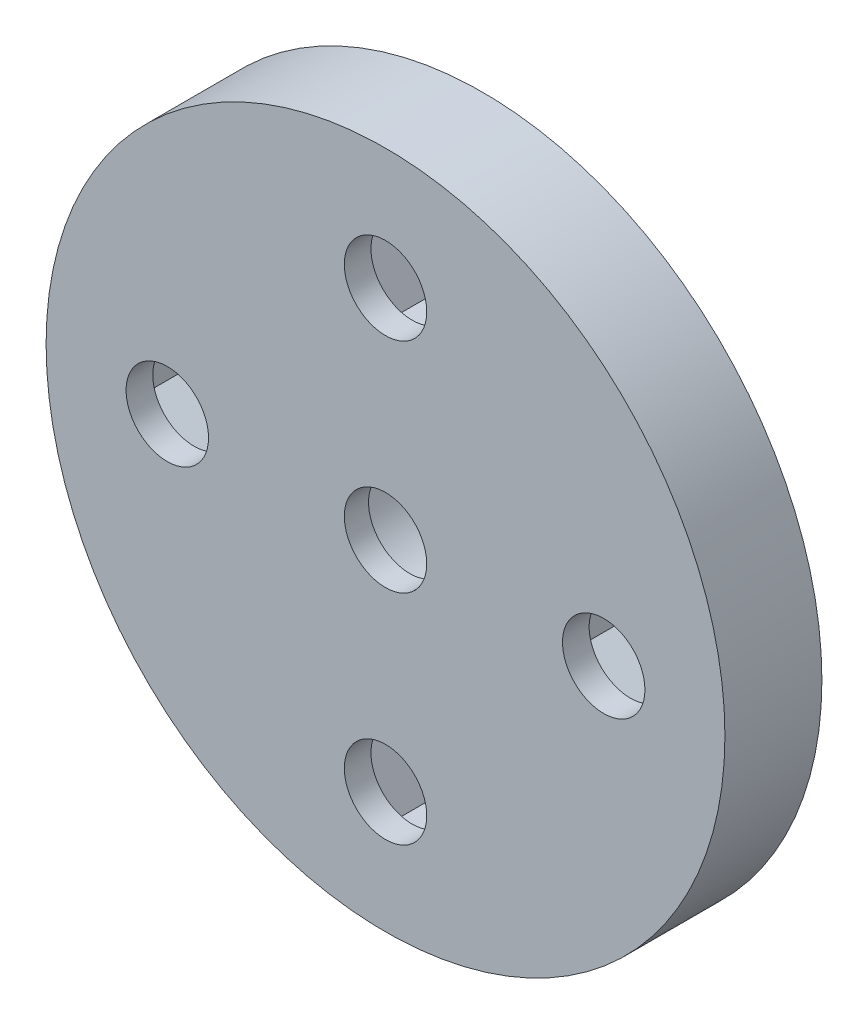
ISO-10303-21;
HEADER;
FILE_DESCRIPTION(('STEP AP214'),'2;1');
FILE_NAME('part.step','',(''),(''),'','','');
FILE_SCHEMA(('AUTOMOTIVE_DESIGN { 1 0 10303 214 1 1 1 1 }'));
ENDSEC;
DATA;
#1=APPLICATION_CONTEXT('core data for automotive mechanical design processes');
#2=APPLICATION_PROTOCOL_DEFINITION('international standard','automotive_design',2000,#1);
#3=PRODUCT_CONTEXT('',#1,'mechanical');
#4=PRODUCT('Part','Part','',(#3));
#5=PRODUCT_RELATED_PRODUCT_CATEGORY('part','',(#4));
#6=PRODUCT_DEFINITION_FORMATION('','',#4);
#7=PRODUCT_DEFINITION_CONTEXT('part definition',#1,'design');
#8=PRODUCT_DEFINITION('design','',#6,#7);
#9=PRODUCT_DEFINITION_SHAPE('','',#8);
#10=(LENGTH_UNIT() NAMED_UNIT(*) SI_UNIT(.MILLI.,.METRE.));
#11=(NAMED_UNIT(*) PLANE_ANGLE_UNIT() SI_UNIT($,.RADIAN.));
#12=(NAMED_UNIT(*) SI_UNIT($,.STERADIAN.) SOLID_ANGLE_UNIT());
#13=UNCERTAINTY_MEASURE_WITH_UNIT(LENGTH_MEASURE(1.E-05),#10,'distance_accuracy_value','');
#14=(GEOMETRIC_REPRESENTATION_CONTEXT(3) GLOBAL_UNCERTAINTY_ASSIGNED_CONTEXT((#13)) GLOBAL_UNIT_ASSIGNED_CONTEXT((#10,
#11,#12)) REPRESENTATION_CONTEXT('',''));
#15=CARTESIAN_POINT('',(0.,0.,0.));
#16=DIRECTION('',(0.,0.,1.));
#17=DIRECTION('',(1.,0.,0.));
#18=AXIS2_PLACEMENT_3D('',#15,#16,#17);
#19=CARTESIAN_POINT('',(0.,0.,0.));
#20=DIRECTION('',(0.,0.,1.));
#21=DIRECTION('',(1.,0.,0.));
#22=AXIS2_PLACEMENT_3D('',#19,#20,#21);
#23=PLANE('',#22);
#24=DIRECTION('',(-1.,0.,0.));
#25=VECTOR('',#24,1.);
#26=CARTESIAN_POINT('',(1.64544826719043,11.85,0.));
#27=LINE('',#26,#25);
#28=CARTESIAN_POINT('',(1.64544826719043,11.85,0.));
#29=VERTEX_POINT('',#28);
#30=CARTESIAN_POINT('',(-1.64544826719043,11.85,0.));
#31=VERTEX_POINT('',#30);
#32=EDGE_CURVE('E72',#29,#31,#27,.T.);
#33=ORIENTED_EDGE('',*,*,#32,.T.);
#34=DIRECTION('',(-0.5,-0.866025403784439,0.));
#35=VECTOR('',#34,1.);
#36=CARTESIAN_POINT('',(-1.64544826719043,11.85,0.));
#37=LINE('',#36,#35);
#38=CARTESIAN_POINT('',(-3.29089653438087,9.,0.));
#39=VERTEX_POINT('',#38);
#40=EDGE_CURVE('E281',#31,#39,#37,.T.);
#41=ORIENTED_EDGE('',*,*,#40,.T.);
#42=DIRECTION('',(0.5,-0.866025403784439,0.));
#43=VECTOR('',#42,1.);
#44=CARTESIAN_POINT('',(-3.29089653438087,9.,0.));
#45=LINE('',#44,#43);
#46=CARTESIAN_POINT('',(-1.64544826719044,6.15,0.));
#47=VERTEX_POINT('',#46);
#48=EDGE_CURVE('E278',#39,#47,#45,.T.);
#49=ORIENTED_EDGE('',*,*,#48,.T.);
#50=DIRECTION('',(1.,0.,0.));
#51=VECTOR('',#50,1.);
#52=CARTESIAN_POINT('',(-1.64544826719044,6.15,0.));
#53=LINE('',#52,#51);
#54=CARTESIAN_POINT('',(1.64544826719043,6.15,0.));
#55=VERTEX_POINT('',#54);
#56=EDGE_CURVE('E277',#47,#55,#53,.T.);
#57=ORIENTED_EDGE('',*,*,#56,.T.);
#58=DIRECTION('',(0.5,0.866025403784439,0.));
#59=VECTOR('',#58,1.);
#60=CARTESIAN_POINT('',(1.64544826719043,6.15,0.));
#61=LINE('',#60,#59);
#62=CARTESIAN_POINT('',(3.29089653438087,9.,0.));
#63=VERTEX_POINT('',#62);
#64=EDGE_CURVE('E271',#55,#63,#61,.T.);
#65=ORIENTED_EDGE('',*,*,#64,.T.);
#66=DIRECTION('',(-0.5,0.866025403784439,0.));
#67=VECTOR('',#66,1.);
#68=CARTESIAN_POINT('',(3.29089653438087,9.,0.));
#69=LINE('',#68,#67);
#70=EDGE_CURVE('E270',#63,#29,#69,.T.);
#71=ORIENTED_EDGE('',*,*,#70,.T.);
#72=EDGE_LOOP('',(#33,#41,#49,#57,#65,#71));
#73=FACE_BOUND('',#72,.T.);
#74=DIRECTION('',(1.,0.,0.));
#75=VECTOR('',#74,1.);
#76=CARTESIAN_POINT('',(-1.64544826719044,-11.85,0.));
#77=LINE('',#76,#75);
#78=CARTESIAN_POINT('',(-1.64544826719044,-11.85,0.));
#79=VERTEX_POINT('',#78);
#80=CARTESIAN_POINT('',(1.64544826719043,-11.85,0.));
#81=VERTEX_POINT('',#80);
#82=EDGE_CURVE('E315',#79,#81,#77,.T.);
#83=ORIENTED_EDGE('',*,*,#82,.T.);
#84=DIRECTION('',(0.5,0.866025403784439,0.));
#85=VECTOR('',#84,1.);
#86=CARTESIAN_POINT('',(1.64544826719043,-11.85,0.));
#87=LINE('',#86,#85);
#88=CARTESIAN_POINT('',(3.29089653438087,-9.,0.));
#89=VERTEX_POINT('',#88);
#90=EDGE_CURVE('E410',#81,#89,#87,.T.);
#91=ORIENTED_EDGE('',*,*,#90,.T.);
#92=DIRECTION('',(-0.5,0.866025403784439,0.));
#93=VECTOR('',#92,1.);
#94=CARTESIAN_POINT('',(3.29089653438087,-9.,0.));
#95=LINE('',#94,#93);
#96=CARTESIAN_POINT('',(1.64544826719043,-6.15,0.));
#97=VERTEX_POINT('',#96);
#98=EDGE_CURVE('E404',#89,#97,#95,.T.);
#99=ORIENTED_EDGE('',*,*,#98,.T.);
#100=DIRECTION('',(-1.,0.,0.));
#101=VECTOR('',#100,1.);
#102=CARTESIAN_POINT('',(1.64544826719043,-6.15,0.));
#103=LINE('',#102,#101);
#104=CARTESIAN_POINT('',(-1.64544826719043,-6.15,0.));
#105=VERTEX_POINT('',#104);
#106=EDGE_CURVE('E399',#97,#105,#103,.T.);
#107=ORIENTED_EDGE('',*,*,#106,.T.);
#108=DIRECTION('',(-0.5,-0.866025403784438,0.));
#109=VECTOR('',#108,1.);
#110=CARTESIAN_POINT('',(-1.64544826719043,-6.15,0.));
#111=LINE('',#110,#109);
#112=CARTESIAN_POINT('',(-3.29089653438087,-9.,0.));
#113=VERTEX_POINT('',#112);
#114=EDGE_CURVE('E393',#105,#113,#111,.T.);
#115=ORIENTED_EDGE('',*,*,#114,.T.);
#116=DIRECTION('',(0.5,-0.866025403784439,0.));
#117=VECTOR('',#116,1.);
#118=CARTESIAN_POINT('',(-3.29089653438087,-9.,0.));
#119=LINE('',#118,#117);
#120=EDGE_CURVE('E392',#113,#79,#119,.T.);
#121=ORIENTED_EDGE('',*,*,#120,.T.);
#122=EDGE_LOOP('',(#83,#91,#99,#107,#115,#121));
#123=FACE_BOUND('',#122,.T.);
#124=CARTESIAN_POINT('',(0.,0.,0.));
#125=DIRECTION('',(0.,0.,1.));
#126=DIRECTION('',(1.,0.,0.));
#127=AXIS2_PLACEMENT_3D('',#124,#125,#126);
#128=CIRCLE('',#127,2.9);
#129=CARTESIAN_POINT('',(2.9,0.,0.));
#130=VERTEX_POINT('',#129);
#131=EDGE_CURVE('E460',#130,#130,#128,.T.);
#132=ORIENTED_EDGE('',*,*,#131,.T.);
#133=EDGE_LOOP('',(#132));
#134=FACE_BOUND('',#133,.T.);
#135=CARTESIAN_POINT('',(0.,0.,0.));
#136=DIRECTION('',(0.,0.,1.));
#137=DIRECTION('',(1.,0.,0.));
#138=AXIS2_PLACEMENT_3D('',#135,#136,#137);
#139=CIRCLE('',#138,14.);
#140=CARTESIAN_POINT('',(14.,0.,0.));
#141=VERTEX_POINT('',#140);
#142=EDGE_CURVE('E54',#141,#141,#139,.T.);
#143=ORIENTED_EDGE('',*,*,#142,.F.);
#144=EDGE_LOOP('',(#143));
#145=FACE_BOUND('',#144,.T.);
#146=DIRECTION('',(0.,-1.,0.));
#147=VECTOR('',#146,1.);
#148=CARTESIAN_POINT('',(-11.85,1.64544826719043,0.));
#149=LINE('',#148,#147);
#150=CARTESIAN_POINT('',(-11.85,1.64544826719043,0.));
#151=VERTEX_POINT('',#150);
#152=CARTESIAN_POINT('',(-11.85,-1.64544826719043,0.));
#153=VERTEX_POINT('',#152);
#154=EDGE_CURVE('E253',#151,#153,#149,.T.);
#155=ORIENTED_EDGE('',*,*,#154,.T.);
#156=DIRECTION('',(0.866025403784439,-0.5,0.));
#157=VECTOR('',#156,1.);
#158=CARTESIAN_POINT('',(-11.85,-1.64544826719043,0.));
#159=LINE('',#158,#157);
#160=CARTESIAN_POINT('',(-9.,-3.29089653438087,0.));
#161=VERTEX_POINT('',#160);
#162=EDGE_CURVE('E347',#153,#161,#159,.T.);
#163=ORIENTED_EDGE('',*,*,#162,.T.);
#164=DIRECTION('',(0.866025403784439,0.5,0.));
#165=VECTOR('',#164,1.);
#166=CARTESIAN_POINT('',(-9.,-3.29089653438087,0.));
#167=LINE('',#166,#165);
#168=CARTESIAN_POINT('',(-6.15,-1.64544826719044,0.));
#169=VERTEX_POINT('',#168);
#170=EDGE_CURVE('E345',#161,#169,#167,.T.);
#171=ORIENTED_EDGE('',*,*,#170,.T.);
#172=DIRECTION('',(0.,1.,0.));
#173=VECTOR('',#172,1.);
#174=CARTESIAN_POINT('',(-6.15,-1.64544826719044,0.));
#175=LINE('',#174,#173);
#176=CARTESIAN_POINT('',(-6.15,1.64544826719043,0.));
#177=VERTEX_POINT('',#176);
#178=EDGE_CURVE('E340',#169,#177,#175,.T.);
#179=ORIENTED_EDGE('',*,*,#178,.T.);
#180=DIRECTION('',(-0.866025403784438,0.5,0.));
#181=VECTOR('',#180,1.);
#182=CARTESIAN_POINT('',(-6.15,1.64544826719043,0.));
#183=LINE('',#182,#181);
#184=CARTESIAN_POINT('',(-9.,3.29089653438087,0.));
#185=VERTEX_POINT('',#184);
#186=EDGE_CURVE('E334',#177,#185,#183,.T.);
#187=ORIENTED_EDGE('',*,*,#186,.T.);
#188=DIRECTION('',(-0.866025403784439,-0.5,0.));
#189=VECTOR('',#188,1.);
#190=CARTESIAN_POINT('',(-9.,3.29089653438087,0.));
#191=LINE('',#190,#189);
#192=EDGE_CURVE('E328',#185,#151,#191,.T.);
#193=ORIENTED_EDGE('',*,*,#192,.T.);
#194=EDGE_LOOP('',(#155,#163,#171,#179,#187,#193));
#195=FACE_BOUND('',#194,.T.);
#196=DIRECTION('',(0.,1.,0.));
#197=VECTOR('',#196,1.);
#198=CARTESIAN_POINT('',(11.85,-1.64544826719044,0.));
#199=LINE('',#198,#197);
#200=CARTESIAN_POINT('',(11.85,-1.64544826719044,0.));
#201=VERTEX_POINT('',#200);
#202=CARTESIAN_POINT('',(11.85,1.64544826719043,0.));
#203=VERTEX_POINT('',#202);
#204=EDGE_CURVE('E65',#201,#203,#199,.T.);
#205=ORIENTED_EDGE('',*,*,#204,.T.);
#206=DIRECTION('',(-0.866025403784439,0.5,0.));
#207=VECTOR('',#206,1.);
#208=CARTESIAN_POINT('',(11.85,1.64544826719043,0.));
#209=LINE('',#208,#207);
#210=CARTESIAN_POINT('',(9.,3.29089653438087,0.));
#211=VERTEX_POINT('',#210);
#212=EDGE_CURVE('E232',#203,#211,#209,.T.);
#213=ORIENTED_EDGE('',*,*,#212,.T.);
#214=DIRECTION('',(-0.866025403784439,-0.5,0.));
#215=VECTOR('',#214,1.);
#216=CARTESIAN_POINT('',(9.,3.29089653438087,0.));
#217=LINE('',#216,#215);
#218=CARTESIAN_POINT('',(6.15,1.64544826719043,0.));
#219=VERTEX_POINT('',#218);
#220=EDGE_CURVE('E514',#211,#219,#217,.T.);
#221=ORIENTED_EDGE('',*,*,#220,.T.);
#222=DIRECTION('',(0.,-1.,0.));
#223=VECTOR('',#222,1.);
#224=CARTESIAN_POINT('',(6.15,1.64544826719043,0.));
#225=LINE('',#224,#223);
#226=CARTESIAN_POINT('',(6.15,-1.64544826719043,0.));
#227=VERTEX_POINT('',#226);
#228=EDGE_CURVE('E525',#219,#227,#225,.T.);
#229=ORIENTED_EDGE('',*,*,#228,.T.);
#230=DIRECTION('',(0.866025403784439,-0.5,0.));
#231=VECTOR('',#230,1.);
#232=CARTESIAN_POINT('',(6.15,-1.64544826719043,0.));
#233=LINE('',#232,#231);
#234=CARTESIAN_POINT('',(9.,-3.29089653438087,0.));
#235=VERTEX_POINT('',#234);
#236=EDGE_CURVE('E528',#227,#235,#233,.T.);
#237=ORIENTED_EDGE('',*,*,#236,.T.);
#238=DIRECTION('',(0.866025403784439,0.5,0.));
#239=VECTOR('',#238,1.);
#240=CARTESIAN_POINT('',(9.,-3.29089653438087,0.));
#241=LINE('',#240,#239);
#242=EDGE_CURVE('E226',#235,#201,#241,.T.);
#243=ORIENTED_EDGE('',*,*,#242,.T.);
#244=EDGE_LOOP('',(#205,#213,#221,#229,#237,#243));
#245=FACE_BOUND('',#244,.T.);
#246=ADVANCED_FACE('F44',(#73,#123,#134,#145,#195,#245),#23,.F.);
#247=CARTESIAN_POINT('',(0.,0.,4.00000000000001));
#248=DIRECTION('',(0.,0.,-1.));
#249=DIRECTION('',(-1.,0.,0.));
#250=AXIS2_PLACEMENT_3D('',#247,#248,#249);
#251=CYLINDRICAL_SURFACE('',#250,14.);
#252=CARTESIAN_POINT('',(0.,0.,4.00000000000001));
#253=DIRECTION('',(0.,0.,1.));
#254=DIRECTION('',(1.,0.,0.));
#255=AXIS2_PLACEMENT_3D('',#252,#253,#254);
#256=CIRCLE('',#255,14.);
#257=CARTESIAN_POINT('',(14.,0.,4.00000000000001));
#258=VERTEX_POINT('',#257);
#259=EDGE_CURVE('E11',#258,#258,#256,.T.);
#260=ORIENTED_EDGE('',*,*,#259,.F.);
#261=EDGE_LOOP('',(#260));
#262=FACE_BOUND('',#261,.T.);
#263=ORIENTED_EDGE('',*,*,#142,.T.);
#264=EDGE_LOOP('',(#263));
#265=FACE_BOUND('',#264,.T.);
#266=ADVANCED_FACE('F50',(#262,#265),#251,.T.);
#267=CARTESIAN_POINT('',(0.,0.,4.00000000000001));
#268=DIRECTION('',(0.,0.,1.));
#269=DIRECTION('',(1.,0.,0.));
#270=AXIS2_PLACEMENT_3D('',#267,#268,#269);
#271=PLANE('',#270);
#272=CARTESIAN_POINT('',(9.,0.,4.));
#273=DIRECTION('',(0.,0.,1.));
#274=DIRECTION('',(1.,0.,0.));
#275=AXIS2_PLACEMENT_3D('',#272,#273,#274);
#276=CIRCLE('',#275,1.7);
#277=CARTESIAN_POINT('',(10.7,0.,4.));
#278=VERTEX_POINT('',#277);
#279=EDGE_CURVE('E435',#278,#278,#276,.T.);
#280=ORIENTED_EDGE('',*,*,#279,.F.);
#281=EDGE_LOOP('',(#280));
#282=FACE_BOUND('',#281,.T.);
#283=CARTESIAN_POINT('',(0.,9.,4.));
#284=DIRECTION('',(0.,0.,1.));
#285=DIRECTION('',(1.,0.,0.));
#286=AXIS2_PLACEMENT_3D('',#283,#284,#285);
#287=CIRCLE('',#286,1.7);
#288=CARTESIAN_POINT('',(1.7,9.,4.));
#289=VERTEX_POINT('',#288);
#290=EDGE_CURVE('E440',#289,#289,#287,.T.);
#291=ORIENTED_EDGE('',*,*,#290,.F.);
#292=EDGE_LOOP('',(#291));
#293=FACE_BOUND('',#292,.T.);
#294=CARTESIAN_POINT('',(-9.,0.,4.));
#295=DIRECTION('',(0.,0.,1.));
#296=DIRECTION('',(1.,0.,0.));
#297=AXIS2_PLACEMENT_3D('',#294,#295,#296);
#298=CIRCLE('',#297,1.7);
#299=CARTESIAN_POINT('',(-7.3,0.,4.));
#300=VERTEX_POINT('',#299);
#301=EDGE_CURVE('E442',#300,#300,#298,.T.);
#302=ORIENTED_EDGE('',*,*,#301,.F.);
#303=EDGE_LOOP('',(#302));
#304=FACE_BOUND('',#303,.T.);
#305=CARTESIAN_POINT('',(0.,-9.,4.));
#306=DIRECTION('',(0.,0.,1.));
#307=DIRECTION('',(1.,0.,0.));
#308=AXIS2_PLACEMENT_3D('',#305,#306,#307);
#309=CIRCLE('',#308,1.7);
#310=CARTESIAN_POINT('',(1.7,-9.,4.));
#311=VERTEX_POINT('',#310);
#312=EDGE_CURVE('E443',#311,#311,#309,.T.);
#313=ORIENTED_EDGE('',*,*,#312,.F.);
#314=EDGE_LOOP('',(#313));
#315=FACE_BOUND('',#314,.T.);
#316=CARTESIAN_POINT('',(0.,0.,4.));
#317=DIRECTION('',(0.,0.,1.));
#318=DIRECTION('',(1.,0.,0.));
#319=AXIS2_PLACEMENT_3D('',#316,#317,#318);
#320=CIRCLE('',#319,1.7);
#321=CARTESIAN_POINT('',(1.7,0.,4.));
#322=VERTEX_POINT('',#321);
#323=EDGE_CURVE('E436',#322,#322,#320,.T.);
#324=ORIENTED_EDGE('',*,*,#323,.F.);
#325=EDGE_LOOP('',(#324));
#326=FACE_BOUND('',#325,.T.);
#327=ORIENTED_EDGE('',*,*,#259,.T.);
#328=EDGE_LOOP('',(#327));
#329=FACE_BOUND('',#328,.T.);
#330=ADVANCED_FACE('F487',(#282,#293,#304,#315,#326,#329),#271,.T.);
#331=CARTESIAN_POINT('',(0.,0.,3.00000000000001));
#332=DIRECTION('',(0.,0.,-1.));
#333=DIRECTION('',(-1.,0.,0.));
#334=AXIS2_PLACEMENT_3D('',#331,#332,#333);
#335=CYLINDRICAL_SURFACE('',#334,2.9);
#336=CARTESIAN_POINT('',(0.,0.,3.00000000000001));
#337=DIRECTION('',(0.,0.,1.));
#338=DIRECTION('',(1.,0.,0.));
#339=AXIS2_PLACEMENT_3D('',#336,#337,#338);
#340=CIRCLE('',#339,2.9);
#341=CARTESIAN_POINT('',(2.9,0.,3.00000000000001));
#342=VERTEX_POINT('',#341);
#343=EDGE_CURVE('E452',#342,#342,#340,.T.);
#344=ORIENTED_EDGE('',*,*,#343,.T.);
#345=EDGE_LOOP('',(#344));
#346=FACE_BOUND('',#345,.T.);
#347=ORIENTED_EDGE('',*,*,#131,.F.);
#348=EDGE_LOOP('',(#347));
#349=FACE_BOUND('',#348,.T.);
#350=ADVANCED_FACE('F495',(#346,#349),#335,.F.);
#351=CARTESIAN_POINT('',(0.,0.,3.00000000000001));
#352=DIRECTION('',(0.,0.,1.));
#353=DIRECTION('',(1.,0.,0.));
#354=AXIS2_PLACEMENT_3D('',#351,#352,#353);
#355=PLANE('',#354);
#356=CARTESIAN_POINT('',(0.,0.,3.00000000000001));
#357=DIRECTION('',(0.,0.,1.));
#358=DIRECTION('',(1.,0.,0.));
#359=AXIS2_PLACEMENT_3D('',#356,#357,#358);
#360=CIRCLE('',#359,1.7);
#361=CARTESIAN_POINT('',(1.7,0.,3.00000000000001));
#362=VERTEX_POINT('',#361);
#363=EDGE_CURVE('E455',#362,#362,#360,.F.);
#364=ORIENTED_EDGE('',*,*,#363,.F.);
#365=EDGE_LOOP('',(#364));
#366=FACE_BOUND('',#365,.T.);
#367=ORIENTED_EDGE('',*,*,#343,.F.);
#368=EDGE_LOOP('',(#367));
#369=FACE_BOUND('',#368,.T.);
#370=ADVANCED_FACE('F672',(#366,#369),#355,.F.);
#371=CARTESIAN_POINT('',(0.,0.,4.));
#372=DIRECTION('',(0.,0.,-1.));
#373=DIRECTION('',(-1.,0.,0.));
#374=AXIS2_PLACEMENT_3D('',#371,#372,#373);
#375=CYLINDRICAL_SURFACE('',#374,1.7);
#376=ORIENTED_EDGE('',*,*,#323,.T.);
#377=EDGE_LOOP('',(#376));
#378=FACE_BOUND('',#377,.T.);
#379=ORIENTED_EDGE('',*,*,#363,.T.);
#380=EDGE_LOOP('',(#379));
#381=FACE_BOUND('',#380,.T.);
#382=ADVANCED_FACE('F484',(#378,#381),#375,.F.);
#383=CARTESIAN_POINT('',(0.,-9.,4.));
#384=DIRECTION('',(0.,0.,-1.));
#385=DIRECTION('',(-1.,0.,0.));
#386=AXIS2_PLACEMENT_3D('',#383,#384,#385);
#387=CYLINDRICAL_SURFACE('',#386,1.7);
#388=CARTESIAN_POINT('',(0.,-9.,2.9));
#389=DIRECTION('',(0.,0.,1.));
#390=DIRECTION('',(1.,0.,0.));
#391=AXIS2_PLACEMENT_3D('',#388,#389,#390);
#392=CIRCLE('',#391,1.7);
#393=CARTESIAN_POINT('',(1.7,-9.,2.9));
#394=VERTEX_POINT('',#393);
#395=EDGE_CURVE('E47',#394,#394,#392,.T.);
#396=ORIENTED_EDGE('',*,*,#395,.F.);
#397=EDGE_LOOP('',(#396));
#398=FACE_BOUND('',#397,.T.);
#399=ORIENTED_EDGE('',*,*,#312,.T.);
#400=EDGE_LOOP('',(#399));
#401=FACE_BOUND('',#400,.T.);
#402=ADVANCED_FACE('F481',(#398,#401),#387,.F.);
#403=CARTESIAN_POINT('',(-9.,0.,4.));
#404=DIRECTION('',(0.,0.,-1.));
#405=DIRECTION('',(-1.,0.,0.));
#406=AXIS2_PLACEMENT_3D('',#403,#404,#405);
#407=CYLINDRICAL_SURFACE('',#406,1.7);
#408=CARTESIAN_POINT('',(-9.,0.,2.9));
#409=DIRECTION('',(0.,0.,1.));
#410=DIRECTION('',(1.,0.,0.));
#411=AXIS2_PLACEMENT_3D('',#408,#409,#410);
#412=CIRCLE('',#411,1.7);
#413=CARTESIAN_POINT('',(-7.3,0.,2.9));
#414=VERTEX_POINT('',#413);
#415=EDGE_CURVE('E468',#414,#414,#412,.T.);
#416=ORIENTED_EDGE('',*,*,#415,.F.);
#417=EDGE_LOOP('',(#416));
#418=FACE_BOUND('',#417,.T.);
#419=ORIENTED_EDGE('',*,*,#301,.T.);
#420=EDGE_LOOP('',(#419));
#421=FACE_BOUND('',#420,.T.);
#422=ADVANCED_FACE('F482',(#418,#421),#407,.F.);
#423=CARTESIAN_POINT('',(0.,9.,4.));
#424=DIRECTION('',(0.,0.,-1.));
#425=DIRECTION('',(-1.,0.,0.));
#426=AXIS2_PLACEMENT_3D('',#423,#424,#425);
#427=CYLINDRICAL_SURFACE('',#426,1.7);
#428=CARTESIAN_POINT('',(0.,9.,2.9));
#429=DIRECTION('',(0.,0.,1.));
#430=DIRECTION('',(1.,0.,0.));
#431=AXIS2_PLACEMENT_3D('',#428,#429,#430);
#432=CIRCLE('',#431,1.7);
#433=CARTESIAN_POINT('',(1.7,9.,2.9));
#434=VERTEX_POINT('',#433);
#435=EDGE_CURVE('E242',#434,#434,#432,.T.);
#436=ORIENTED_EDGE('',*,*,#435,.F.);
#437=EDGE_LOOP('',(#436));
#438=FACE_BOUND('',#437,.T.);
#439=ORIENTED_EDGE('',*,*,#290,.T.);
#440=EDGE_LOOP('',(#439));
#441=FACE_BOUND('',#440,.T.);
#442=ADVANCED_FACE('F664',(#438,#441),#427,.F.);
#443=CARTESIAN_POINT('',(9.,0.,4.));
#444=DIRECTION('',(0.,0.,-1.));
#445=DIRECTION('',(-1.,0.,0.));
#446=AXIS2_PLACEMENT_3D('',#443,#444,#445);
#447=CYLINDRICAL_SURFACE('',#446,1.7);
#448=CARTESIAN_POINT('',(9.,0.,2.9));
#449=DIRECTION('',(0.,0.,1.));
#450=DIRECTION('',(1.,0.,0.));
#451=AXIS2_PLACEMENT_3D('',#448,#449,#450);
#452=CIRCLE('',#451,1.7);
#453=CARTESIAN_POINT('',(10.7,0.,2.9));
#454=VERTEX_POINT('',#453);
#455=EDGE_CURVE('E234',#454,#454,#452,.T.);
#456=ORIENTED_EDGE('',*,*,#455,.F.);
#457=EDGE_LOOP('',(#456));
#458=FACE_BOUND('',#457,.T.);
#459=ORIENTED_EDGE('',*,*,#279,.T.);
#460=EDGE_LOOP('',(#459));
#461=FACE_BOUND('',#460,.T.);
#462=ADVANCED_FACE('F583',(#458,#461),#447,.F.);
#463=CARTESIAN_POINT('',(11.85,-1.64544826719044,2.9));
#464=DIRECTION('',(-1.,0.,0.));
#465=DIRECTION('',(0.,-1.,0.));
#466=AXIS2_PLACEMENT_3D('',#463,#464,#465);
#467=PLANE('',#466);
#468=ORIENTED_EDGE('',*,*,#204,.F.);
#469=DIRECTION('',(0.,0.,-1.));
#470=VECTOR('',#469,1.);
#471=CARTESIAN_POINT('',(11.85,-1.64544826719044,2.9));
#472=LINE('',#471,#470);
#473=CARTESIAN_POINT('',(11.85,-1.64544826719044,2.9));
#474=VERTEX_POINT('',#473);
#475=EDGE_CURVE('E229',#474,#201,#472,.T.);
#476=ORIENTED_EDGE('',*,*,#475,.F.);
#477=DIRECTION('',(0.,1.,0.));
#478=VECTOR('',#477,1.);
#479=CARTESIAN_POINT('',(11.85,-1.64544826719044,2.9));
#480=LINE('',#479,#478);
#481=CARTESIAN_POINT('',(11.85,1.64544826719043,2.9));
#482=VERTEX_POINT('',#481);
#483=EDGE_CURVE('E220',#474,#482,#480,.T.);
#484=ORIENTED_EDGE('',*,*,#483,.T.);
#485=DIRECTION('',(0.,0.,-1.));
#486=VECTOR('',#485,1.);
#487=CARTESIAN_POINT('',(11.85,1.64544826719043,2.9));
#488=LINE('',#487,#486);
#489=EDGE_CURVE('E227',#482,#203,#488,.T.);
#490=ORIENTED_EDGE('',*,*,#489,.T.);
#491=EDGE_LOOP('',(#468,#476,#484,#490));
#492=FACE_BOUND('',#491,.T.);
#493=ADVANCED_FACE('F223',(#492),#467,.T.);
#494=CARTESIAN_POINT('',(11.85,1.64544826719043,2.9));
#495=DIRECTION('',(-0.5,-0.866025403784439,0.));
#496=DIRECTION('',(0.866025403784439,-0.5,0.));
#497=AXIS2_PLACEMENT_3D('',#494,#495,#496);
#498=PLANE('',#497);
#499=ORIENTED_EDGE('',*,*,#212,.F.);
#500=ORIENTED_EDGE('',*,*,#489,.F.);
#501=DIRECTION('',(-0.866025403784439,0.5,0.));
#502=VECTOR('',#501,1.);
#503=CARTESIAN_POINT('',(11.85,1.64544826719043,2.9));
#504=LINE('',#503,#502);
#505=CARTESIAN_POINT('',(9.,3.29089653438087,2.9));
#506=VERTEX_POINT('',#505);
#507=EDGE_CURVE('E213',#482,#506,#504,.T.);
#508=ORIENTED_EDGE('',*,*,#507,.T.);
#509=DIRECTION('',(0.,0.,-1.));
#510=VECTOR('',#509,1.);
#511=CARTESIAN_POINT('',(9.,3.29089653438087,2.9));
#512=LINE('',#511,#510);
#513=EDGE_CURVE('E237',#506,#211,#512,.T.);
#514=ORIENTED_EDGE('',*,*,#513,.T.);
#515=EDGE_LOOP('',(#499,#500,#508,#514));
#516=FACE_BOUND('',#515,.T.);
#517=ADVANCED_FACE('F231',(#516),#498,.T.);
#518=CARTESIAN_POINT('',(9.,3.29089653438087,2.9));
#519=DIRECTION('',(0.5,-0.866025403784439,0.));
#520=DIRECTION('',(0.866025403784439,0.5,0.));
#521=AXIS2_PLACEMENT_3D('',#518,#519,#520);
#522=PLANE('',#521);
#523=ORIENTED_EDGE('',*,*,#220,.F.);
#524=ORIENTED_EDGE('',*,*,#513,.F.);
#525=DIRECTION('',(-0.866025403784439,-0.5,0.));
#526=VECTOR('',#525,1.);
#527=CARTESIAN_POINT('',(9.,3.29089653438087,2.9));
#528=LINE('',#527,#526);
#529=CARTESIAN_POINT('',(6.15,1.64544826719043,2.9));
#530=VERTEX_POINT('',#529);
#531=EDGE_CURVE('E218',#506,#530,#528,.T.);
#532=ORIENTED_EDGE('',*,*,#531,.T.);
#533=DIRECTION('',(0.,0.,-1.));
#534=VECTOR('',#533,1.);
#535=CARTESIAN_POINT('',(6.15,1.64544826719043,2.9));
#536=LINE('',#535,#534);
#537=EDGE_CURVE('E245',#530,#219,#536,.T.);
#538=ORIENTED_EDGE('',*,*,#537,.T.);
#539=EDGE_LOOP('',(#523,#524,#532,#538));
#540=FACE_BOUND('',#539,.T.);
#541=ADVANCED_FACE('F543',(#540),#522,.T.);
#542=CARTESIAN_POINT('',(6.15,1.64544826719043,2.9));
#543=DIRECTION('',(1.,0.,0.));
#544=DIRECTION('',(0.,1.,0.));
#545=AXIS2_PLACEMENT_3D('',#542,#543,#544);
#546=PLANE('',#545);
#547=ORIENTED_EDGE('',*,*,#228,.F.);
#548=ORIENTED_EDGE('',*,*,#537,.F.);
#549=DIRECTION('',(0.,-1.,0.));
#550=VECTOR('',#549,1.);
#551=CARTESIAN_POINT('',(6.15,1.64544826719043,2.9));
#552=LINE('',#551,#550);
#553=CARTESIAN_POINT('',(6.15,-1.64544826719043,2.9));
#554=VERTEX_POINT('',#553);
#555=EDGE_CURVE('E559',#530,#554,#552,.T.);
#556=ORIENTED_EDGE('',*,*,#555,.T.);
#557=DIRECTION('',(0.,0.,-1.));
#558=VECTOR('',#557,1.);
#559=CARTESIAN_POINT('',(6.15,-1.64544826719043,2.9));
#560=LINE('',#559,#558);
#561=EDGE_CURVE('E536',#554,#227,#560,.T.);
#562=ORIENTED_EDGE('',*,*,#561,.T.);
#563=EDGE_LOOP('',(#547,#548,#556,#562));
#564=FACE_BOUND('',#563,.T.);
#565=ADVANCED_FACE('F544',(#564),#546,.T.);
#566=CARTESIAN_POINT('',(6.15,-1.64544826719043,2.9));
#567=DIRECTION('',(0.5,0.866025403784439,0.));
#568=DIRECTION('',(-0.866025403784439,0.5,0.));
#569=AXIS2_PLACEMENT_3D('',#566,#567,#568);
#570=PLANE('',#569);
#571=ORIENTED_EDGE('',*,*,#236,.F.);
#572=ORIENTED_EDGE('',*,*,#561,.F.);
#573=DIRECTION('',(0.866025403784439,-0.5,0.));
#574=VECTOR('',#573,1.);
#575=CARTESIAN_POINT('',(6.15,-1.64544826719043,2.9));
#576=LINE('',#575,#574);
#577=CARTESIAN_POINT('',(9.,-3.29089653438087,2.9));
#578=VERTEX_POINT('',#577);
#579=EDGE_CURVE('E555',#554,#578,#576,.T.);
#580=ORIENTED_EDGE('',*,*,#579,.T.);
#581=DIRECTION('',(0.,0.,-1.));
#582=VECTOR('',#581,1.);
#583=CARTESIAN_POINT('',(9.,-3.29089653438087,2.9));
#584=LINE('',#583,#582);
#585=EDGE_CURVE('E531',#578,#235,#584,.T.);
#586=ORIENTED_EDGE('',*,*,#585,.T.);
#587=EDGE_LOOP('',(#571,#572,#580,#586));
#588=FACE_BOUND('',#587,.T.);
#589=ADVANCED_FACE('F548',(#588),#570,.T.);
#590=CARTESIAN_POINT('',(9.,-3.29089653438087,2.9));
#591=DIRECTION('',(-0.5,0.866025403784439,0.));
#592=DIRECTION('',(-0.866025403784439,-0.5,0.));
#593=AXIS2_PLACEMENT_3D('',#590,#591,#592);
#594=PLANE('',#593);
#595=ORIENTED_EDGE('',*,*,#242,.F.);
#596=ORIENTED_EDGE('',*,*,#585,.F.);
#597=DIRECTION('',(0.866025403784439,0.5,0.));
#598=VECTOR('',#597,1.);
#599=CARTESIAN_POINT('',(9.,-3.29089653438087,2.9));
#600=LINE('',#599,#598);
#601=EDGE_CURVE('E519',#578,#474,#600,.T.);
#602=ORIENTED_EDGE('',*,*,#601,.T.);
#603=ORIENTED_EDGE('',*,*,#475,.T.);
#604=EDGE_LOOP('',(#595,#596,#602,#603));
#605=FACE_BOUND('',#604,.T.);
#606=ADVANCED_FACE('F551',(#605),#594,.T.);
#607=CARTESIAN_POINT('',(0.,0.,2.9));
#608=DIRECTION('',(0.,0.,1.));
#609=DIRECTION('',(1.,0.,0.));
#610=AXIS2_PLACEMENT_3D('',#607,#608,#609);
#611=PLANE('',#610);
#612=ORIENTED_EDGE('',*,*,#455,.T.);
#613=EDGE_LOOP('',(#612));
#614=FACE_BOUND('',#613,.T.);
#615=ORIENTED_EDGE('',*,*,#483,.F.);
#616=ORIENTED_EDGE('',*,*,#601,.F.);
#617=ORIENTED_EDGE('',*,*,#579,.F.);
#618=ORIENTED_EDGE('',*,*,#555,.F.);
#619=ORIENTED_EDGE('',*,*,#531,.F.);
#620=ORIENTED_EDGE('',*,*,#507,.F.);
#621=EDGE_LOOP('',(#615,#616,#617,#618,#619,#620));
#622=FACE_BOUND('',#621,.T.);
#623=ADVANCED_FACE('F214',(#614,#622),#611,.F.);
#624=CARTESIAN_POINT('',(1.64544826719043,11.85,2.9));
#625=DIRECTION('',(0.,-1.,0.));
#626=DIRECTION('',(0.,0.,-1.));
#627=AXIS2_PLACEMENT_3D('',#624,#625,#626);
#628=PLANE('',#627);
#629=ORIENTED_EDGE('',*,*,#32,.F.);
#630=DIRECTION('',(0.,0.,-1.));
#631=VECTOR('',#630,1.);
#632=CARTESIAN_POINT('',(1.64544826719043,11.85,2.9));
#633=LINE('',#632,#631);
#634=CARTESIAN_POINT('',(1.64544826719043,11.85,2.9));
#635=VERTEX_POINT('',#634);
#636=EDGE_CURVE('E263',#635,#29,#633,.T.);
#637=ORIENTED_EDGE('',*,*,#636,.F.);
#638=DIRECTION('',(-1.,0.,0.));
#639=VECTOR('',#638,1.);
#640=CARTESIAN_POINT('',(1.64544826719043,11.85,2.9));
#641=LINE('',#640,#639);
#642=CARTESIAN_POINT('',(-1.64544826719043,11.85,2.9));
#643=VERTEX_POINT('',#642);
#644=EDGE_CURVE('E275',#635,#643,#641,.T.);
#645=ORIENTED_EDGE('',*,*,#644,.T.);
#646=DIRECTION('',(0.,0.,-1.));
#647=VECTOR('',#646,1.);
#648=CARTESIAN_POINT('',(-1.64544826719043,11.85,2.9));
#649=LINE('',#648,#647);
#650=EDGE_CURVE('E250',#643,#31,#649,.T.);
#651=ORIENTED_EDGE('',*,*,#650,.T.);
#652=EDGE_LOOP('',(#629,#637,#645,#651));
#653=FACE_BOUND('',#652,.T.);
#654=ADVANCED_FACE('F566',(#653),#628,.T.);
#655=CARTESIAN_POINT('',(-1.64544826719043,11.85,2.9));
#656=DIRECTION('',(0.866025403784439,-0.5,0.));
#657=DIRECTION('',(0.5,0.866025403784439,0.));
#658=AXIS2_PLACEMENT_3D('',#655,#656,#657);
#659=PLANE('',#658);
#660=ORIENTED_EDGE('',*,*,#40,.F.);
#661=ORIENTED_EDGE('',*,*,#650,.F.);
#662=DIRECTION('',(-0.5,-0.866025403784439,0.));
#663=VECTOR('',#662,1.);
#664=CARTESIAN_POINT('',(-1.64544826719043,11.85,2.9));
#665=LINE('',#664,#663);
#666=CARTESIAN_POINT('',(-3.29089653438087,9.,2.9));
#667=VERTEX_POINT('',#666);
#668=EDGE_CURVE('E301',#643,#667,#665,.T.);
#669=ORIENTED_EDGE('',*,*,#668,.T.);
#670=DIRECTION('',(0.,0.,-1.));
#671=VECTOR('',#670,1.);
#672=CARTESIAN_POINT('',(-3.29089653438087,9.,2.9));
#673=LINE('',#672,#671);
#674=EDGE_CURVE('E249',#667,#39,#673,.T.);
#675=ORIENTED_EDGE('',*,*,#674,.T.);
#676=EDGE_LOOP('',(#660,#661,#669,#675));
#677=FACE_BOUND('',#676,.T.);
#678=ADVANCED_FACE('F585',(#677),#659,.T.);
#679=CARTESIAN_POINT('',(-3.29089653438087,9.,2.9));
#680=DIRECTION('',(0.866025403784439,0.5,0.));
#681=DIRECTION('',(-0.5,0.866025403784439,0.));
#682=AXIS2_PLACEMENT_3D('',#679,#680,#681);
#683=PLANE('',#682);
#684=ORIENTED_EDGE('',*,*,#48,.F.);
#685=ORIENTED_EDGE('',*,*,#674,.F.);
#686=DIRECTION('',(0.5,-0.866025403784439,0.));
#687=VECTOR('',#686,1.);
#688=CARTESIAN_POINT('',(-3.29089653438087,9.,2.9));
#689=LINE('',#688,#687);
#690=CARTESIAN_POINT('',(-1.64544826719044,6.15,2.9));
#691=VERTEX_POINT('',#690);
#692=EDGE_CURVE('E300',#667,#691,#689,.T.);
#693=ORIENTED_EDGE('',*,*,#692,.T.);
#694=DIRECTION('',(0.,0.,-1.));
#695=VECTOR('',#694,1.);
#696=CARTESIAN_POINT('',(-1.64544826719044,6.15,2.9));
#697=LINE('',#696,#695);
#698=EDGE_CURVE('E255',#691,#47,#697,.T.);
#699=ORIENTED_EDGE('',*,*,#698,.T.);
#700=EDGE_LOOP('',(#684,#685,#693,#699));
#701=FACE_BOUND('',#700,.T.);
#702=ADVANCED_FACE('F590',(#701),#683,.T.);
#703=CARTESIAN_POINT('',(-1.64544826719044,6.15,2.9));
#704=DIRECTION('',(0.,1.,0.));
#705=DIRECTION('',(0.,0.,1.));
#706=AXIS2_PLACEMENT_3D('',#703,#704,#705);
#707=PLANE('',#706);
#708=ORIENTED_EDGE('',*,*,#56,.F.);
#709=ORIENTED_EDGE('',*,*,#698,.F.);
#710=DIRECTION('',(1.,0.,0.));
#711=VECTOR('',#710,1.);
#712=CARTESIAN_POINT('',(-1.64544826719044,6.15,2.9));
#713=LINE('',#712,#711);
#714=CARTESIAN_POINT('',(1.64544826719043,6.15,2.9));
#715=VERTEX_POINT('',#714);
#716=EDGE_CURVE('E293',#691,#715,#713,.T.);
#717=ORIENTED_EDGE('',*,*,#716,.T.);
#718=DIRECTION('',(0.,0.,-1.));
#719=VECTOR('',#718,1.);
#720=CARTESIAN_POINT('',(1.64544826719043,6.15,2.9));
#721=LINE('',#720,#719);
#722=EDGE_CURVE('E260',#715,#55,#721,.T.);
#723=ORIENTED_EDGE('',*,*,#722,.T.);
#724=EDGE_LOOP('',(#708,#709,#717,#723));
#725=FACE_BOUND('',#724,.T.);
#726=ADVANCED_FACE('F591',(#725),#707,.T.);
#727=CARTESIAN_POINT('',(1.64544826719043,6.15,2.9));
#728=DIRECTION('',(-0.866025403784439,0.5,0.));
#729=DIRECTION('',(-0.5,-0.866025403784439,0.));
#730=AXIS2_PLACEMENT_3D('',#727,#728,#729);
#731=PLANE('',#730);
#732=ORIENTED_EDGE('',*,*,#64,.F.);
#733=ORIENTED_EDGE('',*,*,#722,.F.);
#734=DIRECTION('',(0.5,0.866025403784439,0.));
#735=VECTOR('',#734,1.);
#736=CARTESIAN_POINT('',(1.64544826719043,6.15,2.9));
#737=LINE('',#736,#735);
#738=CARTESIAN_POINT('',(3.29089653438087,9.,2.9));
#739=VERTEX_POINT('',#738);
#740=EDGE_CURVE('E295',#715,#739,#737,.T.);
#741=ORIENTED_EDGE('',*,*,#740,.T.);
#742=DIRECTION('',(0.,0.,-1.));
#743=VECTOR('',#742,1.);
#744=CARTESIAN_POINT('',(3.29089653438087,9.,2.9));
#745=LINE('',#744,#743);
#746=EDGE_CURVE('E257',#739,#63,#745,.T.);
#747=ORIENTED_EDGE('',*,*,#746,.T.);
#748=EDGE_LOOP('',(#732,#733,#741,#747));
#749=FACE_BOUND('',#748,.T.);
#750=ADVANCED_FACE('F594',(#749),#731,.T.);
#751=CARTESIAN_POINT('',(3.29089653438087,9.,2.9));
#752=DIRECTION('',(-0.866025403784439,-0.5,0.));
#753=DIRECTION('',(0.5,-0.866025403784439,0.));
#754=AXIS2_PLACEMENT_3D('',#751,#752,#753);
#755=PLANE('',#754);
#756=ORIENTED_EDGE('',*,*,#70,.F.);
#757=ORIENTED_EDGE('',*,*,#746,.F.);
#758=DIRECTION('',(-0.5,0.866025403784439,0.));
#759=VECTOR('',#758,1.);
#760=CARTESIAN_POINT('',(3.29089653438087,9.,2.9));
#761=LINE('',#760,#759);
#762=EDGE_CURVE('E266',#739,#635,#761,.T.);
#763=ORIENTED_EDGE('',*,*,#762,.T.);
#764=ORIENTED_EDGE('',*,*,#636,.T.);
#765=EDGE_LOOP('',(#756,#757,#763,#764));
#766=FACE_BOUND('',#765,.T.);
#767=ADVANCED_FACE('F597',(#766),#755,.T.);
#768=CARTESIAN_POINT('',(0.,0.,2.9));
#769=DIRECTION('',(0.,0.,1.));
#770=DIRECTION('',(1.,0.,0.));
#771=AXIS2_PLACEMENT_3D('',#768,#769,#770);
#772=PLANE('',#771);
#773=ORIENTED_EDGE('',*,*,#435,.T.);
#774=EDGE_LOOP('',(#773));
#775=FACE_BOUND('',#774,.T.);
#776=ORIENTED_EDGE('',*,*,#644,.F.);
#777=ORIENTED_EDGE('',*,*,#762,.F.);
#778=ORIENTED_EDGE('',*,*,#740,.F.);
#779=ORIENTED_EDGE('',*,*,#716,.F.);
#780=ORIENTED_EDGE('',*,*,#692,.F.);
#781=ORIENTED_EDGE('',*,*,#668,.F.);
#782=EDGE_LOOP('',(#776,#777,#778,#779,#780,#781));
#783=FACE_BOUND('',#782,.T.);
#784=ADVANCED_FACE('F602',(#775,#783),#772,.F.);
#785=CARTESIAN_POINT('',(-11.85,1.64544826719043,2.9));
#786=DIRECTION('',(1.,0.,0.));
#787=DIRECTION('',(0.,1.,0.));
#788=AXIS2_PLACEMENT_3D('',#785,#786,#787);
#789=PLANE('',#788);
#790=ORIENTED_EDGE('',*,*,#154,.F.);
#791=DIRECTION('',(0.,0.,-1.));
#792=VECTOR('',#791,1.);
#793=CARTESIAN_POINT('',(-11.85,1.64544826719043,2.9));
#794=LINE('',#793,#792);
#795=CARTESIAN_POINT('',(-11.85,1.64544826719043,2.9));
#796=VERTEX_POINT('',#795);
#797=EDGE_CURVE('E322',#796,#151,#794,.T.);
#798=ORIENTED_EDGE('',*,*,#797,.F.);
#799=DIRECTION('',(0.,-1.,0.));
#800=VECTOR('',#799,1.);
#801=CARTESIAN_POINT('',(-11.85,1.64544826719043,2.9));
#802=LINE('',#801,#800);
#803=CARTESIAN_POINT('',(-11.85,-1.64544826719043,2.9));
#804=VERTEX_POINT('',#803);
#805=EDGE_CURVE('E331',#796,#804,#802,.T.);
#806=ORIENTED_EDGE('',*,*,#805,.T.);
#807=DIRECTION('',(0.,0.,-1.));
#808=VECTOR('',#807,1.);
#809=CARTESIAN_POINT('',(-11.85,-1.64544826719043,2.9));
#810=LINE('',#809,#808);
#811=EDGE_CURVE('E307',#804,#153,#810,.T.);
#812=ORIENTED_EDGE('',*,*,#811,.T.);
#813=EDGE_LOOP('',(#790,#798,#806,#812));
#814=FACE_BOUND('',#813,.T.);
#815=ADVANCED_FACE('F610',(#814),#789,.T.);
#816=CARTESIAN_POINT('',(-11.85,-1.64544826719043,2.9));
#817=DIRECTION('',(0.5,0.866025403784439,0.));
#818=DIRECTION('',(-0.866025403784439,0.5,0.));
#819=AXIS2_PLACEMENT_3D('',#816,#817,#818);
#820=PLANE('',#819);
#821=ORIENTED_EDGE('',*,*,#162,.F.);
#822=ORIENTED_EDGE('',*,*,#811,.F.);
#823=DIRECTION('',(0.866025403784439,-0.5,0.));
#824=VECTOR('',#823,1.);
#825=CARTESIAN_POINT('',(-11.85,-1.64544826719043,2.9));
#826=LINE('',#825,#824);
#827=CARTESIAN_POINT('',(-9.,-3.29089653438087,2.9));
#828=VERTEX_POINT('',#827);
#829=EDGE_CURVE('E365',#804,#828,#826,.T.);
#830=ORIENTED_EDGE('',*,*,#829,.T.);
#831=DIRECTION('',(0.,0.,-1.));
#832=VECTOR('',#831,1.);
#833=CARTESIAN_POINT('',(-9.,-3.29089653438087,2.9));
#834=LINE('',#833,#832);
#835=EDGE_CURVE('E313',#828,#161,#834,.T.);
#836=ORIENTED_EDGE('',*,*,#835,.T.);
#837=EDGE_LOOP('',(#821,#822,#830,#836));
#838=FACE_BOUND('',#837,.T.);
#839=ADVANCED_FACE('F612',(#838),#820,.T.);
#840=CARTESIAN_POINT('',(-9.,-3.29089653438087,2.9));
#841=DIRECTION('',(-0.5,0.866025403784439,0.));
#842=DIRECTION('',(-0.866025403784439,-0.5,0.));
#843=AXIS2_PLACEMENT_3D('',#840,#841,#842);
#844=PLANE('',#843);
#845=ORIENTED_EDGE('',*,*,#170,.F.);
#846=ORIENTED_EDGE('',*,*,#835,.F.);
#847=DIRECTION('',(0.866025403784439,0.5,0.));
#848=VECTOR('',#847,1.);
#849=CARTESIAN_POINT('',(-9.,-3.29089653438087,2.9));
#850=LINE('',#849,#848);
#851=CARTESIAN_POINT('',(-6.15,-1.64544826719044,2.9));
#852=VERTEX_POINT('',#851);
#853=EDGE_CURVE('E363',#828,#852,#850,.T.);
#854=ORIENTED_EDGE('',*,*,#853,.T.);
#855=DIRECTION('',(0.,0.,-1.));
#856=VECTOR('',#855,1.);
#857=CARTESIAN_POINT('',(-6.15,-1.64544826719044,2.9));
#858=LINE('',#857,#856);
#859=EDGE_CURVE('E312',#852,#169,#858,.T.);
#860=ORIENTED_EDGE('',*,*,#859,.T.);
#861=EDGE_LOOP('',(#845,#846,#854,#860));
#862=FACE_BOUND('',#861,.T.);
#863=ADVANCED_FACE('F613',(#862),#844,.T.);
#864=CARTESIAN_POINT('',(-6.15,-1.64544826719044,2.9));
#865=DIRECTION('',(-1.,0.,0.));
#866=DIRECTION('',(0.,0.,1.));
#867=AXIS2_PLACEMENT_3D('',#864,#865,#866);
#868=PLANE('',#867);
#869=ORIENTED_EDGE('',*,*,#178,.F.);
#870=ORIENTED_EDGE('',*,*,#859,.F.);
#871=DIRECTION('',(0.,1.,0.));
#872=VECTOR('',#871,1.);
#873=CARTESIAN_POINT('',(-6.15,-1.64544826719044,2.9));
#874=LINE('',#873,#872);
#875=CARTESIAN_POINT('',(-6.15,1.64544826719043,2.9));
#876=VERTEX_POINT('',#875);
#877=EDGE_CURVE('E357',#852,#876,#874,.T.);
#878=ORIENTED_EDGE('',*,*,#877,.T.);
#879=DIRECTION('',(0.,0.,-1.));
#880=VECTOR('',#879,1.);
#881=CARTESIAN_POINT('',(-6.15,1.64544826719043,2.9));
#882=LINE('',#881,#880);
#883=EDGE_CURVE('E318',#876,#177,#882,.T.);
#884=ORIENTED_EDGE('',*,*,#883,.T.);
#885=EDGE_LOOP('',(#869,#870,#878,#884));
#886=FACE_BOUND('',#885,.T.);
#887=ADVANCED_FACE('F618',(#886),#868,.T.);
#888=CARTESIAN_POINT('',(-6.15,1.64544826719043,2.9));
#889=DIRECTION('',(-0.5,-0.866025403784438,0.));
#890=DIRECTION('',(0.866025403784438,-0.5,0.));
#891=AXIS2_PLACEMENT_3D('',#888,#889,#890);
#892=PLANE('',#891);
#893=ORIENTED_EDGE('',*,*,#186,.F.);
#894=ORIENTED_EDGE('',*,*,#883,.F.);
#895=DIRECTION('',(-0.866025403784438,0.5,0.));
#896=VECTOR('',#895,1.);
#897=CARTESIAN_POINT('',(-6.15,1.64544826719043,2.9));
#898=LINE('',#897,#896);
#899=CARTESIAN_POINT('',(-9.,3.29089653438087,2.9));
#900=VERTEX_POINT('',#899);
#901=EDGE_CURVE('E353',#876,#900,#898,.T.);
#902=ORIENTED_EDGE('',*,*,#901,.T.);
#903=DIRECTION('',(0.,0.,-1.));
#904=VECTOR('',#903,1.);
#905=CARTESIAN_POINT('',(-9.,3.29089653438087,2.9));
#906=LINE('',#905,#904);
#907=EDGE_CURVE('E321',#900,#185,#906,.T.);
#908=ORIENTED_EDGE('',*,*,#907,.T.);
#909=EDGE_LOOP('',(#893,#894,#902,#908));
#910=FACE_BOUND('',#909,.T.);
#911=ADVANCED_FACE('F621',(#910),#892,.T.);
#912=CARTESIAN_POINT('',(-9.,3.29089653438087,2.9));
#913=DIRECTION('',(0.5,-0.866025403784439,0.));
#914=DIRECTION('',(0.866025403784439,0.5,0.));
#915=AXIS2_PLACEMENT_3D('',#912,#913,#914);
#916=PLANE('',#915);
#917=ORIENTED_EDGE('',*,*,#192,.F.);
#918=ORIENTED_EDGE('',*,*,#907,.F.);
#919=DIRECTION('',(-0.866025403784439,-0.5,0.));
#920=VECTOR('',#919,1.);
#921=CARTESIAN_POINT('',(-9.,3.29089653438087,2.9));
#922=LINE('',#921,#920);
#923=EDGE_CURVE('E327',#900,#796,#922,.T.);
#924=ORIENTED_EDGE('',*,*,#923,.T.);
#925=ORIENTED_EDGE('',*,*,#797,.T.);
#926=EDGE_LOOP('',(#917,#918,#924,#925));
#927=FACE_BOUND('',#926,.T.);
#928=ADVANCED_FACE('F629',(#927),#916,.T.);
#929=CARTESIAN_POINT('',(0.,0.,2.9));
#930=DIRECTION('',(0.,0.,1.));
#931=DIRECTION('',(1.,0.,0.));
#932=AXIS2_PLACEMENT_3D('',#929,#930,#931);
#933=PLANE('',#932);
#934=ORIENTED_EDGE('',*,*,#415,.T.);
#935=EDGE_LOOP('',(#934));
#936=FACE_BOUND('',#935,.T.);
#937=ORIENTED_EDGE('',*,*,#805,.F.);
#938=ORIENTED_EDGE('',*,*,#923,.F.);
#939=ORIENTED_EDGE('',*,*,#901,.F.);
#940=ORIENTED_EDGE('',*,*,#877,.F.);
#941=ORIENTED_EDGE('',*,*,#853,.F.);
#942=ORIENTED_EDGE('',*,*,#829,.F.);
#943=EDGE_LOOP('',(#937,#938,#939,#940,#941,#942));
#944=FACE_BOUND('',#943,.T.);
#945=ADVANCED_FACE('F631',(#936,#944),#933,.F.);
#946=CARTESIAN_POINT('',(-1.64544826719044,-11.85,2.9));
#947=DIRECTION('',(0.,1.,0.));
#948=DIRECTION('',(0.,0.,1.));
#949=AXIS2_PLACEMENT_3D('',#946,#947,#948);
#950=PLANE('',#949);
#951=ORIENTED_EDGE('',*,*,#82,.F.);
#952=DIRECTION('',(0.,0.,-1.));
#953=VECTOR('',#952,1.);
#954=CARTESIAN_POINT('',(-1.64544826719044,-11.85,2.9));
#955=LINE('',#954,#953);
#956=CARTESIAN_POINT('',(-1.64544826719044,-11.85,2.9));
#957=VERTEX_POINT('',#956);
#958=EDGE_CURVE('E387',#957,#79,#955,.T.);
#959=ORIENTED_EDGE('',*,*,#958,.F.);
#960=DIRECTION('',(1.,0.,0.));
#961=VECTOR('',#960,1.);
#962=CARTESIAN_POINT('',(-1.64544826719044,-11.85,2.9));
#963=LINE('',#962,#961);
#964=CARTESIAN_POINT('',(1.64544826719043,-11.85,2.9));
#965=VERTEX_POINT('',#964);
#966=EDGE_CURVE('E396',#957,#965,#963,.T.);
#967=ORIENTED_EDGE('',*,*,#966,.T.);
#968=DIRECTION('',(0.,0.,-1.));
#969=VECTOR('',#968,1.);
#970=CARTESIAN_POINT('',(1.64544826719043,-11.85,2.9));
#971=LINE('',#970,#969);
#972=EDGE_CURVE('E367',#965,#81,#971,.T.);
#973=ORIENTED_EDGE('',*,*,#972,.T.);
#974=EDGE_LOOP('',(#951,#959,#967,#973));
#975=FACE_BOUND('',#974,.T.);
#976=ADVANCED_FACE('F634',(#975),#950,.T.);
#977=CARTESIAN_POINT('',(1.64544826719043,-11.85,2.9));
#978=DIRECTION('',(-0.866025403784439,0.5,0.));
#979=DIRECTION('',(-0.5,-0.866025403784439,0.));
#980=AXIS2_PLACEMENT_3D('',#977,#978,#979);
#981=PLANE('',#980);
#982=ORIENTED_EDGE('',*,*,#90,.F.);
#983=ORIENTED_EDGE('',*,*,#972,.F.);
#984=DIRECTION('',(0.5,0.866025403784439,0.));
#985=VECTOR('',#984,1.);
#986=CARTESIAN_POINT('',(1.64544826719043,-11.85,2.9));
#987=LINE('',#986,#985);
#988=CARTESIAN_POINT('',(3.29089653438087,-9.,2.9));
#989=VERTEX_POINT('',#988);
#990=EDGE_CURVE('E426',#965,#989,#987,.T.);
#991=ORIENTED_EDGE('',*,*,#990,.T.);
#992=DIRECTION('',(0.,0.,-1.));
#993=VECTOR('',#992,1.);
#994=CARTESIAN_POINT('',(3.29089653438087,-9.,2.9));
#995=LINE('',#994,#993);
#996=EDGE_CURVE('E372',#989,#89,#995,.T.);
#997=ORIENTED_EDGE('',*,*,#996,.T.);
#998=EDGE_LOOP('',(#982,#983,#991,#997));
#999=FACE_BOUND('',#998,.T.);
#1000=ADVANCED_FACE('F636',(#999),#981,.T.);
#1001=CARTESIAN_POINT('',(3.29089653438087,-9.,2.9));
#1002=DIRECTION('',(-0.866025403784439,-0.5,0.));
#1003=DIRECTION('',(0.5,-0.866025403784439,0.));
#1004=AXIS2_PLACEMENT_3D('',#1001,#1002,#1003);
#1005=PLANE('',#1004);
#1006=ORIENTED_EDGE('',*,*,#98,.F.);
#1007=ORIENTED_EDGE('',*,*,#996,.F.);
#1008=DIRECTION('',(-0.5,0.866025403784439,0.));
#1009=VECTOR('',#1008,1.);
#1010=CARTESIAN_POINT('',(3.29089653438087,-9.,2.9));
#1011=LINE('',#1010,#1009);
#1012=CARTESIAN_POINT('',(1.64544826719043,-6.15,2.9));
#1013=VERTEX_POINT('',#1012);
#1014=EDGE_CURVE('E421',#989,#1013,#1011,.T.);
#1015=ORIENTED_EDGE('',*,*,#1014,.T.);
#1016=DIRECTION('',(0.,0.,-1.));
#1017=VECTOR('',#1016,1.);
#1018=CARTESIAN_POINT('',(1.64544826719043,-6.15,2.9));
#1019=LINE('',#1018,#1017);
#1020=EDGE_CURVE('E380',#1013,#97,#1019,.T.);
#1021=ORIENTED_EDGE('',*,*,#1020,.T.);
#1022=EDGE_LOOP('',(#1006,#1007,#1015,#1021));
#1023=FACE_BOUND('',#1022,.T.);
#1024=ADVANCED_FACE('F645',(#1023),#1005,.T.);
#1025=CARTESIAN_POINT('',(1.64544826719043,-6.15,2.9));
#1026=DIRECTION('',(0.,-1.,0.));
#1027=DIRECTION('',(1.,0.,0.));
#1028=AXIS2_PLACEMENT_3D('',#1025,#1026,#1027);
#1029=PLANE('',#1028);
#1030=ORIENTED_EDGE('',*,*,#106,.F.);
#1031=ORIENTED_EDGE('',*,*,#1020,.F.);
#1032=DIRECTION('',(-1.,0.,0.));
#1033=VECTOR('',#1032,1.);
#1034=CARTESIAN_POINT('',(1.64544826719043,-6.15,2.9));
#1035=LINE('',#1034,#1033);
#1036=CARTESIAN_POINT('',(-1.64544826719043,-6.15,2.9));
#1037=VERTEX_POINT('',#1036);
#1038=EDGE_CURVE('E419',#1013,#1037,#1035,.T.);
#1039=ORIENTED_EDGE('',*,*,#1038,.T.);
#1040=DIRECTION('',(0.,0.,-1.));
#1041=VECTOR('',#1040,1.);
#1042=CARTESIAN_POINT('',(-1.64544826719043,-6.15,2.9));
#1043=LINE('',#1042,#1041);
#1044=EDGE_CURVE('E379',#1037,#105,#1043,.T.);
#1045=ORIENTED_EDGE('',*,*,#1044,.T.);
#1046=EDGE_LOOP('',(#1030,#1031,#1039,#1045));
#1047=FACE_BOUND('',#1046,.T.);
#1048=ADVANCED_FACE('F646',(#1047),#1029,.T.);
#1049=CARTESIAN_POINT('',(-1.64544826719043,-6.15,2.9));
#1050=DIRECTION('',(0.866025403784439,-0.5,0.));
#1051=DIRECTION('',(0.5,0.866025403784439,0.));
#1052=AXIS2_PLACEMENT_3D('',#1049,#1050,#1051);
#1053=PLANE('',#1052);
#1054=ORIENTED_EDGE('',*,*,#114,.F.);
#1055=ORIENTED_EDGE('',*,*,#1044,.F.);
#1056=DIRECTION('',(-0.5,-0.866025403784438,0.));
#1057=VECTOR('',#1056,1.);
#1058=CARTESIAN_POINT('',(-1.64544826719043,-6.15,2.9));
#1059=LINE('',#1058,#1057);
#1060=CARTESIAN_POINT('',(-3.29089653438087,-9.,2.9));
#1061=VERTEX_POINT('',#1060);
#1062=EDGE_CURVE('E417',#1037,#1061,#1059,.T.);
#1063=ORIENTED_EDGE('',*,*,#1062,.T.);
#1064=DIRECTION('',(0.,0.,-1.));
#1065=VECTOR('',#1064,1.);
#1066=CARTESIAN_POINT('',(-3.29089653438087,-9.,2.9));
#1067=LINE('',#1066,#1065);
#1068=EDGE_CURVE('E382',#1061,#113,#1067,.T.);
#1069=ORIENTED_EDGE('',*,*,#1068,.T.);
#1070=EDGE_LOOP('',(#1054,#1055,#1063,#1069));
#1071=FACE_BOUND('',#1070,.T.);
#1072=ADVANCED_FACE('F649',(#1071),#1053,.T.);
#1073=CARTESIAN_POINT('',(-3.29089653438087,-9.,2.9));
#1074=DIRECTION('',(0.866025403784439,0.5,0.));
#1075=DIRECTION('',(-0.5,0.866025403784439,0.));
#1076=AXIS2_PLACEMENT_3D('',#1073,#1074,#1075);
#1077=PLANE('',#1076);
#1078=ORIENTED_EDGE('',*,*,#120,.F.);
#1079=ORIENTED_EDGE('',*,*,#1068,.F.);
#1080=DIRECTION('',(0.5,-0.866025403784439,0.));
#1081=VECTOR('',#1080,1.);
#1082=CARTESIAN_POINT('',(-3.29089653438087,-9.,2.9));
#1083=LINE('',#1082,#1081);
#1084=EDGE_CURVE('E388',#1061,#957,#1083,.T.);
#1085=ORIENTED_EDGE('',*,*,#1084,.T.);
#1086=ORIENTED_EDGE('',*,*,#958,.T.);
#1087=EDGE_LOOP('',(#1078,#1079,#1085,#1086));
#1088=FACE_BOUND('',#1087,.T.);
#1089=ADVANCED_FACE('F652',(#1088),#1077,.T.);
#1090=CARTESIAN_POINT('',(0.,0.,2.9));
#1091=DIRECTION('',(0.,0.,1.));
#1092=DIRECTION('',(1.,0.,0.));
#1093=AXIS2_PLACEMENT_3D('',#1090,#1091,#1092);
#1094=PLANE('',#1093);
#1095=ORIENTED_EDGE('',*,*,#395,.T.);
#1096=EDGE_LOOP('',(#1095));
#1097=FACE_BOUND('',#1096,.T.);
#1098=ORIENTED_EDGE('',*,*,#966,.F.);
#1099=ORIENTED_EDGE('',*,*,#1084,.F.);
#1100=ORIENTED_EDGE('',*,*,#1062,.F.);
#1101=ORIENTED_EDGE('',*,*,#1038,.F.);
#1102=ORIENTED_EDGE('',*,*,#1014,.F.);
#1103=ORIENTED_EDGE('',*,*,#990,.F.);
#1104=EDGE_LOOP('',(#1098,#1099,#1100,#1101,#1102,#1103));
#1105=FACE_BOUND('',#1104,.T.);
#1106=ADVANCED_FACE('F476',(#1097,#1105),#1094,.F.);
#1107=CLOSED_SHELL('',(#246,#266,#330,#350,#370,#382,#402,#422,#442,#462,#493,#517,#541,#565,
#589,#606,#623,#654,#678,#702,#726,#750,#767,#784,#815,#839,#863,#887,#911,#928,#945,#976,#1000,
#1024,#1048,#1072,#1089,#1106));
#1108=MANIFOLD_SOLID_BREP('B2',#1107);
#1109=ADVANCED_BREP_SHAPE_REPRESENTATION('',(#18,#1108),#14);
#1110=SHAPE_DEFINITION_REPRESENTATION(#9,#1109);
ENDSEC;
END-ISO-10303-21;
